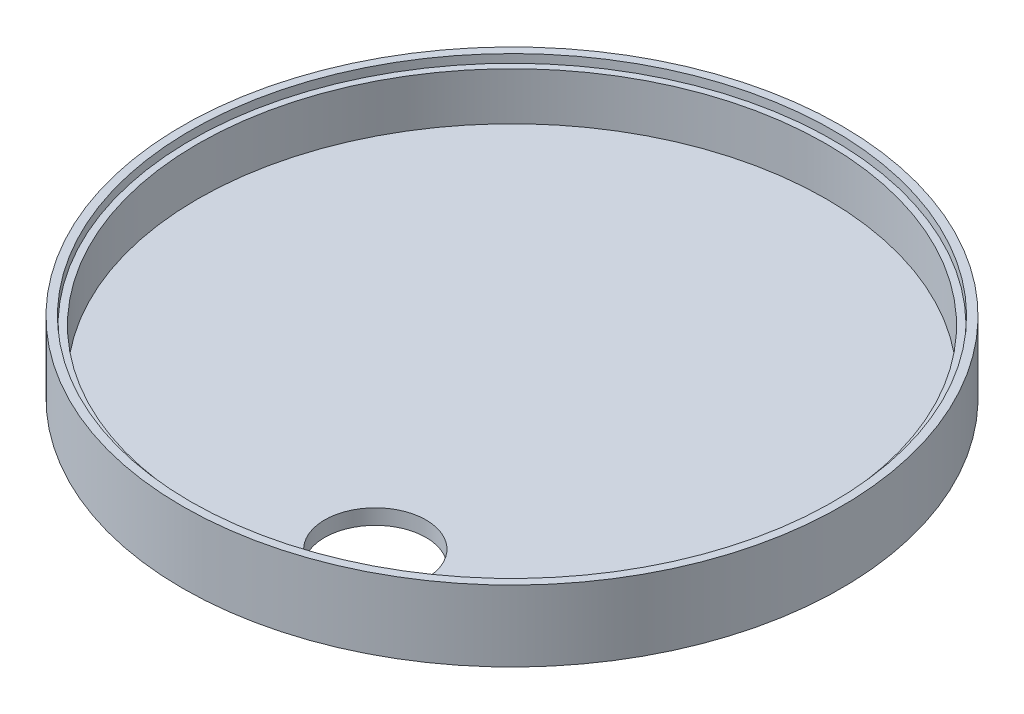
ISO-10303-21;
HEADER;
FILE_DESCRIPTION(('STEP AP214'),'2;1');
FILE_NAME('part.step','',(''),(''),'','','');
FILE_SCHEMA(('AUTOMOTIVE_DESIGN { 1 0 10303 214 1 1 1 1 }'));
ENDSEC;
DATA;
#1=APPLICATION_CONTEXT('core data for automotive mechanical design processes');
#2=APPLICATION_PROTOCOL_DEFINITION('international standard','automotive_design',2000,#1);
#3=PRODUCT_CONTEXT('',#1,'mechanical');
#4=PRODUCT('Part','Part','',(#3));
#5=PRODUCT_RELATED_PRODUCT_CATEGORY('part','',(#4));
#6=PRODUCT_DEFINITION_FORMATION('','',#4);
#7=PRODUCT_DEFINITION_CONTEXT('part definition',#1,'design');
#8=PRODUCT_DEFINITION('design','',#6,#7);
#9=PRODUCT_DEFINITION_SHAPE('','',#8);
#10=(LENGTH_UNIT() NAMED_UNIT(*) SI_UNIT(.MILLI.,.METRE.));
#11=(NAMED_UNIT(*) PLANE_ANGLE_UNIT() SI_UNIT($,.RADIAN.));
#12=(NAMED_UNIT(*) SI_UNIT($,.STERADIAN.) SOLID_ANGLE_UNIT());
#13=UNCERTAINTY_MEASURE_WITH_UNIT(LENGTH_MEASURE(1.E-05),#10,'distance_accuracy_value','');
#14=(GEOMETRIC_REPRESENTATION_CONTEXT(3) GLOBAL_UNCERTAINTY_ASSIGNED_CONTEXT((#13)) GLOBAL_UNIT_ASSIGNED_CONTEXT((#10,
#11,#12)) REPRESENTATION_CONTEXT('',''));
#15=CARTESIAN_POINT('',(0.,0.,0.));
#16=DIRECTION('',(0.,0.,1.));
#17=DIRECTION('',(1.,0.,0.));
#18=AXIS2_PLACEMENT_3D('',#15,#16,#17);
#19=CARTESIAN_POINT('',(0.,17.78,0.));
#20=DIRECTION('',(0.,1.,0.));
#21=DIRECTION('',(0.,0.,1.));
#22=AXIS2_PLACEMENT_3D('',#19,#20,#21);
#23=PLANE('',#22);
#24=CARTESIAN_POINT('',(0.,17.78,0.));
#25=DIRECTION('',(0.,1.,0.));
#26=DIRECTION('',(0.,0.,1.));
#27=AXIS2_PLACEMENT_3D('',#24,#25,#26);
#28=CIRCLE('',#27,82.55);
#29=CARTESIAN_POINT('',(0.,17.78,-82.55));
#30=VERTEX_POINT('',#29);
#31=EDGE_CURVE('E96',#30,#30,#28,.T.);
#32=ORIENTED_EDGE('',*,*,#31,.T.);
#33=EDGE_LOOP('',(#32));
#34=FACE_BOUND('',#33,.T.);
#35=CARTESIAN_POINT('',(0.,17.78,0.));
#36=DIRECTION('',(0.,1.,0.));
#37=DIRECTION('',(0.,0.,1.));
#38=AXIS2_PLACEMENT_3D('',#35,#36,#37);
#39=CIRCLE('',#38,80.518);
#40=CARTESIAN_POINT('',(0.,17.78,80.518));
#41=VERTEX_POINT('',#40);
#42=EDGE_CURVE('E114',#41,#41,#39,.F.);
#43=ORIENTED_EDGE('',*,*,#42,.T.);
#44=EDGE_LOOP('',(#43));
#45=FACE_BOUND('',#44,.T.);
#46=ADVANCED_FACE('F83',(#34,#45),#23,.T.);
#47=CARTESIAN_POINT('',(0.,17.78,0.));
#48=DIRECTION('',(0.,-1.,0.));
#49=DIRECTION('',(0.,0.,-1.));
#50=AXIS2_PLACEMENT_3D('',#47,#48,#49);
#51=CYLINDRICAL_SURFACE('',#50,78.74);
#52=CARTESIAN_POINT('',(0.,3.81,0.));
#53=DIRECTION('',(0.,1.,0.));
#54=DIRECTION('',(0.,0.,1.));
#55=AXIS2_PLACEMENT_3D('',#52,#53,#54);
#56=CIRCLE('',#55,78.74);
#57=CARTESIAN_POINT('',(0.,3.81,78.74));
#58=VERTEX_POINT('',#57);
#59=EDGE_CURVE('E12',#58,#58,#56,.F.);
#60=ORIENTED_EDGE('',*,*,#59,.T.);
#61=EDGE_LOOP('',(#60));
#62=FACE_BOUND('',#61,.T.);
#63=CARTESIAN_POINT('',(0.,15.748,0.));
#64=DIRECTION('',(0.,1.,0.));
#65=DIRECTION('',(0.,0.,1.));
#66=AXIS2_PLACEMENT_3D('',#63,#64,#65);
#67=CIRCLE('',#66,78.74);
#68=CARTESIAN_POINT('',(0.,15.748,78.74));
#69=VERTEX_POINT('',#68);
#70=EDGE_CURVE('E87',#69,#69,#67,.T.);
#71=ORIENTED_EDGE('',*,*,#70,.T.);
#72=EDGE_LOOP('',(#71));
#73=FACE_BOUND('',#72,.T.);
#74=ADVANCED_FACE('F134',(#62,#73),#51,.F.);
#75=CARTESIAN_POINT('',(0.,3.81,0.));
#76=DIRECTION('',(0.,-1.,0.));
#77=DIRECTION('',(0.,0.,-1.));
#78=AXIS2_PLACEMENT_3D('',#75,#76,#77);
#79=CYLINDRICAL_SURFACE('',#78,82.55);
#80=CARTESIAN_POINT('',(0.,0.,0.));
#81=DIRECTION('',(0.,1.,0.));
#82=DIRECTION('',(0.,0.,1.));
#83=AXIS2_PLACEMENT_3D('',#80,#81,#82);
#84=CIRCLE('',#83,82.55);
#85=CARTESIAN_POINT('',(0.,0.,-82.55));
#86=VERTEX_POINT('',#85);
#87=EDGE_CURVE('E91',#86,#86,#84,.T.);
#88=CARTESIAN_POINT('',(0.,0.,-82.55));
#89=CARTESIAN_POINT('',(0.,0.185208333333333,-82.55));
#90=CARTESIAN_POINT('',(0.,0.370416666666667,-82.55));
#91=CARTESIAN_POINT('',(0.,0.740833333333333,-82.55));
#92=CARTESIAN_POINT('',(0.,0.926041666666667,-82.55));
#93=CARTESIAN_POINT('',(0.,1.29645833333333,-82.55));
#94=CARTESIAN_POINT('',(0.,1.48166666666667,-82.55));
#95=CARTESIAN_POINT('',(0.,1.85208333333333,-82.55));
#96=CARTESIAN_POINT('',(0.,2.03729166666667,-82.55));
#97=CARTESIAN_POINT('',(0.,2.40770833333333,-82.55));
#98=CARTESIAN_POINT('',(0.,2.59291666666667,-82.55));
#99=CARTESIAN_POINT('',(0.,2.96333333333333,-82.55));
#100=CARTESIAN_POINT('',(0.,3.14854166666667,-82.55));
#101=CARTESIAN_POINT('',(0.,3.51895833333333,-82.55));
#102=CARTESIAN_POINT('',(0.,3.70416666666667,-82.55));
#103=CARTESIAN_POINT('',(0.,4.07458333333333,-82.55));
#104=CARTESIAN_POINT('',(0.,4.25979166666667,-82.55));
#105=CARTESIAN_POINT('',(0.,4.63020833333333,-82.55));
#106=CARTESIAN_POINT('',(0.,4.81541666666667,-82.55));
#107=CARTESIAN_POINT('',(0.,5.18583333333333,-82.55));
#108=CARTESIAN_POINT('',(0.,5.37104166666667,-82.55));
#109=CARTESIAN_POINT('',(0.,5.74145833333333,-82.55));
#110=CARTESIAN_POINT('',(0.,5.92666666666667,-82.55));
#111=CARTESIAN_POINT('',(0.,6.29708333333333,-82.55));
#112=CARTESIAN_POINT('',(0.,6.48229166666667,-82.55));
#113=CARTESIAN_POINT('',(0.,6.85270833333333,-82.55));
#114=CARTESIAN_POINT('',(0.,7.03791666666667,-82.55));
#115=CARTESIAN_POINT('',(0.,7.40833333333333,-82.55));
#116=CARTESIAN_POINT('',(0.,7.59354166666667,-82.55));
#117=CARTESIAN_POINT('',(0.,7.96395833333333,-82.55));
#118=CARTESIAN_POINT('',(0.,8.14916666666667,-82.55));
#119=CARTESIAN_POINT('',(0.,8.51958333333333,-82.55));
#120=CARTESIAN_POINT('',(0.,8.70479166666667,-82.55));
#121=CARTESIAN_POINT('',(0.,9.07520833333333,-82.55));
#122=CARTESIAN_POINT('',(0.,9.26041666666666,-82.55));
#123=CARTESIAN_POINT('',(0.,9.63083333333333,-82.55));
#124=CARTESIAN_POINT('',(0.,9.81604166666667,-82.55));
#125=CARTESIAN_POINT('',(0.,10.1864583333333,-82.55));
#126=CARTESIAN_POINT('',(0.,10.3716666666667,-82.55));
#127=CARTESIAN_POINT('',(0.,10.7420833333333,-82.55));
#128=CARTESIAN_POINT('',(0.,10.9272916666667,-82.55));
#129=CARTESIAN_POINT('',(0.,11.2977083333333,-82.55));
#130=CARTESIAN_POINT('',(0.,11.4829166666667,-82.55));
#131=CARTESIAN_POINT('',(0.,11.8533333333333,-82.55));
#132=CARTESIAN_POINT('',(0.,12.0385416666667,-82.55));
#133=CARTESIAN_POINT('',(0.,12.4089583333333,-82.55));
#134=CARTESIAN_POINT('',(0.,12.5941666666667,-82.55));
#135=CARTESIAN_POINT('',(0.,12.9645833333333,-82.55));
#136=CARTESIAN_POINT('',(0.,13.1497916666667,-82.55));
#137=CARTESIAN_POINT('',(0.,13.5202083333333,-82.55));
#138=CARTESIAN_POINT('',(0.,13.7054166666667,-82.55));
#139=CARTESIAN_POINT('',(0.,14.0758333333333,-82.55));
#140=CARTESIAN_POINT('',(0.,14.2610416666667,-82.55));
#141=CARTESIAN_POINT('',(0.,14.6314583333333,-82.55));
#142=CARTESIAN_POINT('',(0.,14.8166666666667,-82.55));
#143=CARTESIAN_POINT('',(0.,15.1870833333333,-82.55));
#144=CARTESIAN_POINT('',(0.,15.3722916666667,-82.55));
#145=CARTESIAN_POINT('',(0.,15.7427083333333,-82.55));
#146=CARTESIAN_POINT('',(0.,15.9279166666667,-82.55));
#147=CARTESIAN_POINT('',(0.,16.2983333333333,-82.55));
#148=CARTESIAN_POINT('',(0.,16.4835416666667,-82.55));
#149=CARTESIAN_POINT('',(0.,16.8539583333333,-82.55));
#150=CARTESIAN_POINT('',(0.,17.0391666666667,-82.55));
#151=CARTESIAN_POINT('',(0.,17.4095833333333,-82.55));
#152=CARTESIAN_POINT('',(0.,17.5947916666667,-82.55));
#153=CARTESIAN_POINT('',(0.,17.78,-82.55));
#154=B_SPLINE_CURVE_WITH_KNOTS('',3,(#88,#89,#90,#91,#92,#93,#94,#95,#96,#97,#98,#99,#100,#101,
#102,#103,#104,#105,#106,#107,#108,#109,#110,#111,#112,#113,#114,#115,#116,#117,#118,#119,#120,
#121,#122,#123,#124,#125,#126,#127,#128,#129,#130,#131,#132,#133,#134,#135,#136,#137,#138,#139,
#140,#141,#142,#143,#144,#145,#146,#147,#148,#149,#150,#151,#152,#153),.UNSPECIFIED.,.F.,.F.,(4,
2,2,2,2,2,2,2,2,2,2,2,2,2,2,2,2,2,2,2,2,2,2,2,2,2,2,2,2,2,2,2,4),(0.,0.555625,1.11125,1.666875,
2.2225,2.778125,3.33375,3.889375,4.445,5.000625,5.55625,6.111875,6.6675,7.223125,7.77875,
8.334375,8.89,9.445625,10.00125,10.556875,11.1125,11.668125,12.22375,12.779375,13.335,13.890625,
14.44625,15.001875,15.5575,16.113125,16.66875,17.224375,17.78),.UNSPECIFIED.);
#155=EDGE_CURVE('BSEAM85',#86,#30,#154,.T.);
#156=ORIENTED_EDGE('',*,*,#87,.T.);
#157=ORIENTED_EDGE('',*,*,#31,.F.);
#158=ORIENTED_EDGE('',*,*,#155,.T.);
#159=ORIENTED_EDGE('',*,*,#155,.F.);
#160=EDGE_LOOP('',(#156,#158,#157,#159));
#161=FACE_BOUND('',#160,.T.);
#162=ADVANCED_FACE('F85',(#161),#79,.T.);
#163=CARTESIAN_POINT('',(0.,0.,0.));
#164=DIRECTION('',(0.,1.,0.));
#165=DIRECTION('',(0.,0.,1.));
#166=AXIS2_PLACEMENT_3D('',#163,#164,#165);
#167=PLANE('',#166);
#168=CARTESIAN_POINT('',(19.4901146226293,0.,53.7239046607446));
#169=DIRECTION('',(0.,-1.,0.));
#170=DIRECTION('',(0.,0.,-1.));
#171=AXIS2_PLACEMENT_3D('',#168,#169,#170);
#172=CIRCLE('',#171,12.7);
#173=CARTESIAN_POINT('',(19.4901146226293,0.,41.0239046607447));
#174=VERTEX_POINT('',#173);
#175=EDGE_CURVE('E101',#174,#174,#172,.T.);
#176=ORIENTED_EDGE('',*,*,#175,.F.);
#177=EDGE_LOOP('',(#176));
#178=FACE_BOUND('',#177,.T.);
#179=ORIENTED_EDGE('',*,*,#87,.F.);
#180=EDGE_LOOP('',(#179));
#181=FACE_BOUND('',#180,.T.);
#182=ADVANCED_FACE('F143',(#178,#181),#167,.F.);
#183=CARTESIAN_POINT('',(0.,3.81,0.));
#184=DIRECTION('',(0.,1.,0.));
#185=DIRECTION('',(0.,0.,1.));
#186=AXIS2_PLACEMENT_3D('',#183,#184,#185);
#187=PLANE('',#186);
#188=CARTESIAN_POINT('',(19.4901146226293,3.81,53.7239046607446));
#189=DIRECTION('',(0.,1.,0.));
#190=DIRECTION('',(0.,0.,1.));
#191=AXIS2_PLACEMENT_3D('',#188,#189,#190);
#192=CIRCLE('',#191,12.7);
#193=CARTESIAN_POINT('',(19.4901146226293,3.81,41.0239046607447));
#194=VERTEX_POINT('',#193);
#195=EDGE_CURVE('E99',#194,#194,#192,.T.);
#196=ORIENTED_EDGE('',*,*,#195,.F.);
#197=EDGE_LOOP('',(#196));
#198=FACE_BOUND('',#197,.T.);
#199=ORIENTED_EDGE('',*,*,#59,.F.);
#200=EDGE_LOOP('',(#199));
#201=FACE_BOUND('',#200,.T.);
#202=ADVANCED_FACE('F131',(#198,#201),#187,.T.);
#203=CARTESIAN_POINT('',(19.4901146226293,17.78,53.7239046607446));
#204=DIRECTION('',(0.,-1.,0.));
#205=DIRECTION('',(0.,0.,-1.));
#206=AXIS2_PLACEMENT_3D('',#203,#204,#205);
#207=CYLINDRICAL_SURFACE('',#206,12.7);
#208=CARTESIAN_POINT('',(19.4901146226293,3.81,41.0239046607447));
#209=CARTESIAN_POINT('',(19.4901146226293,3.7703125,41.0239046607447));
#210=CARTESIAN_POINT('',(19.4901146226293,3.730625,41.0239046607447));
#211=CARTESIAN_POINT('',(19.4901146226293,3.65125,41.0239046607447));
#212=CARTESIAN_POINT('',(19.4901146226293,3.6115625,41.0239046607447));
#213=CARTESIAN_POINT('',(19.4901146226293,3.5321875,41.0239046607447));
#214=CARTESIAN_POINT('',(19.4901146226293,3.4925,41.0239046607447));
#215=CARTESIAN_POINT('',(19.4901146226293,3.413125,41.0239046607447));
#216=CARTESIAN_POINT('',(19.4901146226293,3.3734375,41.0239046607447));
#217=CARTESIAN_POINT('',(19.4901146226293,3.2940625,41.0239046607447));
#218=CARTESIAN_POINT('',(19.4901146226293,3.254375,41.0239046607447));
#219=CARTESIAN_POINT('',(19.4901146226293,3.175,41.0239046607447));
#220=CARTESIAN_POINT('',(19.4901146226293,3.1353125,41.0239046607447));
#221=CARTESIAN_POINT('',(19.4901146226293,3.0559375,41.0239046607447));
#222=CARTESIAN_POINT('',(19.4901146226293,3.01625,41.0239046607447));
#223=CARTESIAN_POINT('',(19.4901146226293,2.936875,41.0239046607447));
#224=CARTESIAN_POINT('',(19.4901146226293,2.8971875,41.0239046607447));
#225=CARTESIAN_POINT('',(19.4901146226293,2.8178125,41.0239046607447));
#226=CARTESIAN_POINT('',(19.4901146226293,2.778125,41.0239046607447));
#227=CARTESIAN_POINT('',(19.4901146226293,2.69875,41.0239046607447));
#228=CARTESIAN_POINT('',(19.4901146226293,2.6590625,41.0239046607447));
#229=CARTESIAN_POINT('',(19.4901146226293,2.5796875,41.0239046607447));
#230=CARTESIAN_POINT('',(19.4901146226293,2.54,41.0239046607447));
#231=CARTESIAN_POINT('',(19.4901146226293,2.460625,41.0239046607447));
#232=CARTESIAN_POINT('',(19.4901146226293,2.4209375,41.0239046607447));
#233=CARTESIAN_POINT('',(19.4901146226293,2.3415625,41.0239046607447));
#234=CARTESIAN_POINT('',(19.4901146226293,2.301875,41.0239046607447));
#235=CARTESIAN_POINT('',(19.4901146226293,2.2225,41.0239046607447));
#236=CARTESIAN_POINT('',(19.4901146226293,2.1828125,41.0239046607447));
#237=CARTESIAN_POINT('',(19.4901146226293,2.1034375,41.0239046607447));
#238=CARTESIAN_POINT('',(19.4901146226293,2.06375,41.0239046607447));
#239=CARTESIAN_POINT('',(19.4901146226293,1.984375,41.0239046607447));
#240=CARTESIAN_POINT('',(19.4901146226293,1.9446875,41.0239046607447));
#241=CARTESIAN_POINT('',(19.4901146226293,1.8653125,41.0239046607447));
#242=CARTESIAN_POINT('',(19.4901146226293,1.825625,41.0239046607447));
#243=CARTESIAN_POINT('',(19.4901146226293,1.74625,41.0239046607447));
#244=CARTESIAN_POINT('',(19.4901146226293,1.7065625,41.0239046607447));
#245=CARTESIAN_POINT('',(19.4901146226293,1.6271875,41.0239046607447));
#246=CARTESIAN_POINT('',(19.4901146226293,1.5875,41.0239046607447));
#247=CARTESIAN_POINT('',(19.4901146226293,1.508125,41.0239046607447));
#248=CARTESIAN_POINT('',(19.4901146226293,1.4684375,41.0239046607447));
#249=CARTESIAN_POINT('',(19.4901146226293,1.3890625,41.0239046607447));
#250=CARTESIAN_POINT('',(19.4901146226293,1.349375,41.0239046607447));
#251=CARTESIAN_POINT('',(19.4901146226293,1.27,41.0239046607447));
#252=CARTESIAN_POINT('',(19.4901146226293,1.2303125,41.0239046607447));
#253=CARTESIAN_POINT('',(19.4901146226293,1.1509375,41.0239046607447));
#254=CARTESIAN_POINT('',(19.4901146226293,1.11125,41.0239046607447));
#255=CARTESIAN_POINT('',(19.4901146226293,1.031875,41.0239046607447));
#256=CARTESIAN_POINT('',(19.4901146226293,0.992187500000002,41.0239046607447));
#257=CARTESIAN_POINT('',(19.4901146226293,0.912812500000001,41.0239046607447));
#258=CARTESIAN_POINT('',(19.4901146226293,0.873125,41.0239046607447));
#259=CARTESIAN_POINT('',(19.4901146226293,0.793749999999999,41.0239046607447));
#260=CARTESIAN_POINT('',(19.4901146226293,0.7540625,41.0239046607447));
#261=CARTESIAN_POINT('',(19.4901146226293,0.6746875,41.0239046607447));
#262=CARTESIAN_POINT('',(19.4901146226293,0.635,41.0239046607447));
#263=CARTESIAN_POINT('',(19.4901146226293,0.555625000000001,41.0239046607447));
#264=CARTESIAN_POINT('',(19.4901146226293,0.515937500000001,41.0239046607447));
#265=CARTESIAN_POINT('',(19.4901146226293,0.436562500000001,41.0239046607447));
#266=CARTESIAN_POINT('',(19.4901146226293,0.396875000000001,41.0239046607447));
#267=CARTESIAN_POINT('',(19.4901146226293,0.317500000000001,41.0239046607447));
#268=CARTESIAN_POINT('',(19.4901146226293,0.2778125,41.0239046607447));
#269=CARTESIAN_POINT('',(19.4901146226293,0.198437499999999,41.0239046607447));
#270=CARTESIAN_POINT('',(19.4901146226293,0.158749999999999,41.0239046607447));
#271=CARTESIAN_POINT('',(19.4901146226293,0.0793749999999996,41.0239046607447));
#272=CARTESIAN_POINT('',(19.4901146226293,0.0396874999999998,41.0239046607447));
#273=CARTESIAN_POINT('',(19.4901146226293,0.,41.0239046607447));
#274=B_SPLINE_CURVE_WITH_KNOTS('',3,(#208,#209,#210,#211,#212,#213,#214,#215,#216,#217,#218,
#219,#220,#221,#222,#223,#224,#225,#226,#227,#228,#229,#230,#231,#232,#233,#234,#235,#236,#237,
#238,#239,#240,#241,#242,#243,#244,#245,#246,#247,#248,#249,#250,#251,#252,#253,#254,#255,#256,
#257,#258,#259,#260,#261,#262,#263,#264,#265,#266,#267,#268,#269,#270,#271,#272,#273),
.UNSPECIFIED.,.F.,.F.,(4,2,2,2,2,2,2,2,2,2,2,2,2,2,2,2,2,2,2,2,2,2,2,2,2,2,2,2,2,2,2,2,4),(0.,
0.119062499999999,0.238125,0.3571875,0.476250000000001,0.5953125,0.714375,0.833437500000001,
0.9525,1.0715625,1.190625,1.3096875,1.42875,1.5478125,1.666875,1.7859375,1.905,2.0240625,
2.143125,2.2621875,2.38125,2.5003125,2.619375,2.7384375,2.8575,2.9765625,3.095625,3.2146875,
3.33375,3.4528125,3.571875,3.6909375,3.81),.UNSPECIFIED.);
#275=EDGE_CURVE('BSEAM122',#194,#174,#274,.T.);
#276=ORIENTED_EDGE('',*,*,#195,.T.);
#277=ORIENTED_EDGE('',*,*,#175,.T.);
#278=ORIENTED_EDGE('',*,*,#275,.T.);
#279=ORIENTED_EDGE('',*,*,#275,.F.);
#280=EDGE_LOOP('',(#276,#278,#277,#279));
#281=FACE_BOUND('',#280,.T.);
#282=ADVANCED_FACE('F122',(#281),#207,.F.);
#283=CARTESIAN_POINT('',(0.,17.78,0.));
#284=DIRECTION('',(0.,1.,0.));
#285=DIRECTION('',(0.,0.,1.));
#286=AXIS2_PLACEMENT_3D('',#283,#284,#285);
#287=CONICAL_SURFACE('',#286,80.518,0.0523598775598298);
#288=CARTESIAN_POINT('',(0.,15.748,0.));
#289=DIRECTION('',(0.,1.,0.));
#290=DIRECTION('',(0.,0.,1.));
#291=AXIS2_PLACEMENT_3D('',#288,#289,#290);
#292=CIRCLE('',#291,80.4115073924969);
#293=CARTESIAN_POINT('',(0.,15.748,80.4115073924969));
#294=VERTEX_POINT('',#293);
#295=EDGE_CURVE('E110',#294,#294,#292,.F.);
#296=ORIENTED_EDGE('',*,*,#295,.T.);
#297=EDGE_LOOP('',(#296));
#298=FACE_BOUND('',#297,.T.);
#299=ORIENTED_EDGE('',*,*,#42,.F.);
#300=EDGE_LOOP('',(#299));
#301=FACE_BOUND('',#300,.T.);
#302=ADVANCED_FACE('F119',(#298,#301),#287,.F.);
#303=CARTESIAN_POINT('',(0.,15.748,0.));
#304=DIRECTION('',(0.,1.,0.));
#305=DIRECTION('',(0.,0.,1.));
#306=AXIS2_PLACEMENT_3D('',#303,#304,#305);
#307=PLANE('',#306);
#308=ORIENTED_EDGE('',*,*,#70,.F.);
#309=EDGE_LOOP('',(#308));
#310=FACE_BOUND('',#309,.T.);
#311=ORIENTED_EDGE('',*,*,#295,.F.);
#312=EDGE_LOOP('',(#311));
#313=FACE_BOUND('',#312,.T.);
#314=ADVANCED_FACE('F121',(#310,#313),#307,.T.);
#315=CLOSED_SHELL('',(#46,#74,#162,#182,#202,#282,#302,#314));
#316=MANIFOLD_SOLID_BREP('B2',#315);
#317=ADVANCED_BREP_SHAPE_REPRESENTATION('',(#18,#316),#14);
#318=SHAPE_DEFINITION_REPRESENTATION(#9,#317);
ENDSEC;
END-ISO-10303-21;
